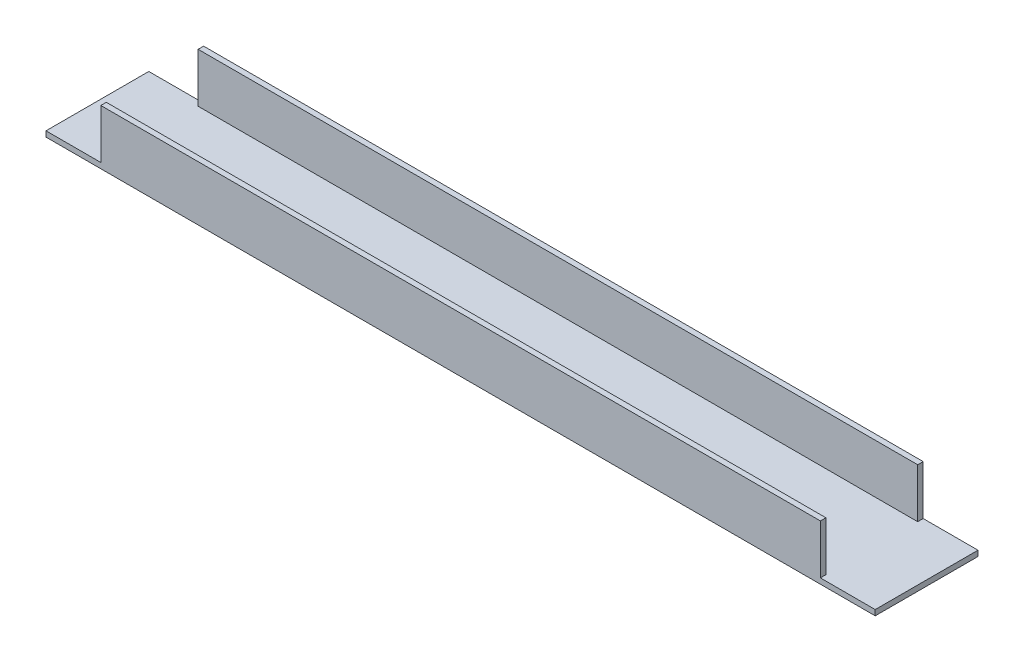
ISO-10303-21;
HEADER;
FILE_DESCRIPTION(('STEP AP214'),'2;1');
FILE_NAME('part.step','',(''),(''),'','','');
FILE_SCHEMA(('AUTOMOTIVE_DESIGN { 1 0 10303 214 1 1 1 1 }'));
ENDSEC;
DATA;
#1=APPLICATION_CONTEXT('core data for automotive mechanical design processes');
#2=APPLICATION_PROTOCOL_DEFINITION('international standard','automotive_design',2000,#1);
#3=PRODUCT_CONTEXT('',#1,'mechanical');
#4=PRODUCT('Part','Part','',(#3));
#5=PRODUCT_RELATED_PRODUCT_CATEGORY('part','',(#4));
#6=PRODUCT_DEFINITION_FORMATION('','',#4);
#7=PRODUCT_DEFINITION_CONTEXT('part definition',#1,'design');
#8=PRODUCT_DEFINITION('design','',#6,#7);
#9=PRODUCT_DEFINITION_SHAPE('','',#8);
#10=(LENGTH_UNIT() NAMED_UNIT(*) SI_UNIT(.MILLI.,.METRE.));
#11=(NAMED_UNIT(*) PLANE_ANGLE_UNIT() SI_UNIT($,.RADIAN.));
#12=(NAMED_UNIT(*) SI_UNIT($,.STERADIAN.) SOLID_ANGLE_UNIT());
#13=UNCERTAINTY_MEASURE_WITH_UNIT(LENGTH_MEASURE(1.E-05),#10,'distance_accuracy_value','');
#14=(GEOMETRIC_REPRESENTATION_CONTEXT(3) GLOBAL_UNCERTAINTY_ASSIGNED_CONTEXT((#13)) GLOBAL_UNIT_ASSIGNED_CONTEXT((#10,
#11,#12)) REPRESENTATION_CONTEXT('',''));
#15=CARTESIAN_POINT('',(0.,0.,0.));
#16=DIRECTION('',(0.,0.,1.));
#17=DIRECTION('',(1.,0.,0.));
#18=AXIS2_PLACEMENT_3D('',#15,#16,#17);
#19=CARTESIAN_POINT('',(0.,4.,0.));
#20=DIRECTION('',(1.,0.,0.));
#21=DIRECTION('',(0.,0.,-1.));
#22=AXIS2_PLACEMENT_3D('',#19,#20,#21);
#23=PLANE('',#22);
#24=DIRECTION('',(0.,0.,1.));
#25=VECTOR('',#24,1.);
#26=CARTESIAN_POINT('',(0.,0.,0.));
#27=LINE('',#26,#25);
#28=CARTESIAN_POINT('',(0.,0.,-75.));
#29=VERTEX_POINT('',#28);
#30=CARTESIAN_POINT('',(0.,0.,0.));
#31=VERTEX_POINT('',#30);
#32=EDGE_CURVE('E222',#29,#31,#27,.T.);
#33=ORIENTED_EDGE('',*,*,#32,.T.);
#34=DIRECTION('',(0.,-1.,0.));
#35=VECTOR('',#34,1.);
#36=CARTESIAN_POINT('',(0.,4.,0.));
#37=LINE('',#36,#35);
#38=CARTESIAN_POINT('',(0.,4.,0.));
#39=VERTEX_POINT('',#38);
#40=EDGE_CURVE('E11',#39,#31,#37,.T.);
#41=ORIENTED_EDGE('',*,*,#40,.F.);
#42=DIRECTION('',(0.,0.,1.));
#43=VECTOR('',#42,1.);
#44=CARTESIAN_POINT('',(0.,4.,0.));
#45=LINE('',#44,#43);
#46=CARTESIAN_POINT('',(0.,4.,-75.));
#47=VERTEX_POINT('',#46);
#48=EDGE_CURVE('E223',#47,#39,#45,.T.);
#49=ORIENTED_EDGE('',*,*,#48,.F.);
#50=DIRECTION('',(0.,-1.,0.));
#51=VECTOR('',#50,1.);
#52=CARTESIAN_POINT('',(0.,4.,-75.));
#53=LINE('',#52,#51);
#54=EDGE_CURVE('E240',#47,#29,#53,.T.);
#55=ORIENTED_EDGE('',*,*,#54,.T.);
#56=EDGE_LOOP('',(#33,#41,#49,#55));
#57=FACE_BOUND('',#56,.T.);
#58=ADVANCED_FACE('F45',(#57),#23,.F.);
#59=CARTESIAN_POINT('',(0.,4.,0.));
#60=DIRECTION('',(0.,0.,-1.));
#61=DIRECTION('',(-1.,0.,0.));
#62=AXIS2_PLACEMENT_3D('',#59,#60,#61);
#63=PLANE('',#62);
#64=DIRECTION('',(1.,0.,0.));
#65=VECTOR('',#64,1.);
#66=CARTESIAN_POINT('',(0.,0.,0.));
#67=LINE('',#66,#65);
#68=CARTESIAN_POINT('',(605.,0.,0.));
#69=VERTEX_POINT('',#68);
#70=EDGE_CURVE('E244',#31,#69,#67,.T.);
#71=ORIENTED_EDGE('',*,*,#70,.T.);
#72=DIRECTION('',(0.,-1.,0.));
#73=VECTOR('',#72,1.);
#74=CARTESIAN_POINT('',(605.,4.,0.));
#75=LINE('',#74,#73);
#76=CARTESIAN_POINT('',(605.,4.,0.));
#77=VERTEX_POINT('',#76);
#78=EDGE_CURVE('E53',#77,#69,#75,.T.);
#79=ORIENTED_EDGE('',*,*,#78,.F.);
#80=DIRECTION('',(1.,0.,0.));
#81=VECTOR('',#80,1.);
#82=CARTESIAN_POINT('',(0.,4.,0.));
#83=LINE('',#82,#81);
#84=CARTESIAN_POINT('',(565.,4.,0.));
#85=VERTEX_POINT('',#84);
#86=EDGE_CURVE('E227',#85,#77,#83,.T.);
#87=ORIENTED_EDGE('',*,*,#86,.F.);
#88=DIRECTION('',(0.,-1.,0.));
#89=VECTOR('',#88,1.);
#90=CARTESIAN_POINT('',(565.,40.,0.));
#91=LINE('',#90,#89);
#92=CARTESIAN_POINT('',(565.,40.,0.));
#93=VERTEX_POINT('',#92);
#94=EDGE_CURVE('E198',#93,#85,#91,.T.);
#95=ORIENTED_EDGE('',*,*,#94,.F.);
#96=DIRECTION('',(-1.,0.,0.));
#97=VECTOR('',#96,1.);
#98=CARTESIAN_POINT('',(0.,40.,0.));
#99=LINE('',#98,#97);
#100=CARTESIAN_POINT('',(40.,40.,0.));
#101=VERTEX_POINT('',#100);
#102=EDGE_CURVE('E182',#93,#101,#99,.T.);
#103=ORIENTED_EDGE('',*,*,#102,.T.);
#104=DIRECTION('',(0.,-1.,0.));
#105=VECTOR('',#104,1.);
#106=CARTESIAN_POINT('',(40.,40.,0.));
#107=LINE('',#106,#105);
#108=CARTESIAN_POINT('',(40.,4.,0.));
#109=VERTEX_POINT('',#108);
#110=EDGE_CURVE('E197',#101,#109,#107,.T.);
#111=ORIENTED_EDGE('',*,*,#110,.T.);
#112=EDGE_CURVE('E229',#39,#109,#83,.T.);
#113=ORIENTED_EDGE('',*,*,#112,.F.);
#114=ORIENTED_EDGE('',*,*,#40,.T.);
#115=EDGE_LOOP('',(#71,#79,#87,#95,#103,#111,#113,#114));
#116=FACE_BOUND('',#115,.T.);
#117=ADVANCED_FACE('F280',(#116),#63,.F.);
#118=CARTESIAN_POINT('',(605.,4.,0.));
#119=DIRECTION('',(-1.,0.,0.));
#120=DIRECTION('',(0.,0.,1.));
#121=AXIS2_PLACEMENT_3D('',#118,#119,#120);
#122=PLANE('',#121);
#123=DIRECTION('',(0.,0.,-1.));
#124=VECTOR('',#123,1.);
#125=CARTESIAN_POINT('',(605.,0.,0.));
#126=LINE('',#125,#124);
#127=CARTESIAN_POINT('',(605.,0.,-75.));
#128=VERTEX_POINT('',#127);
#129=EDGE_CURVE('E247',#69,#128,#126,.T.);
#130=ORIENTED_EDGE('',*,*,#129,.T.);
#131=DIRECTION('',(0.,-1.,0.));
#132=VECTOR('',#131,1.);
#133=CARTESIAN_POINT('',(605.,4.,-75.));
#134=LINE('',#133,#132);
#135=CARTESIAN_POINT('',(605.,4.,-75.));
#136=VERTEX_POINT('',#135);
#137=EDGE_CURVE('E255',#136,#128,#134,.T.);
#138=ORIENTED_EDGE('',*,*,#137,.F.);
#139=DIRECTION('',(0.,0.,-1.));
#140=VECTOR('',#139,1.);
#141=CARTESIAN_POINT('',(605.,4.,0.));
#142=LINE('',#141,#140);
#143=EDGE_CURVE('E233',#77,#136,#142,.T.);
#144=ORIENTED_EDGE('',*,*,#143,.F.);
#145=ORIENTED_EDGE('',*,*,#78,.T.);
#146=EDGE_LOOP('',(#130,#138,#144,#145));
#147=FACE_BOUND('',#146,.T.);
#148=ADVANCED_FACE('F264',(#147),#122,.F.);
#149=CARTESIAN_POINT('',(0.,4.,-75.));
#150=DIRECTION('',(0.,0.,1.));
#151=DIRECTION('',(1.,0.,0.));
#152=AXIS2_PLACEMENT_3D('',#149,#150,#151);
#153=PLANE('',#152);
#154=DIRECTION('',(-1.,0.,0.));
#155=VECTOR('',#154,1.);
#156=CARTESIAN_POINT('',(0.,0.,-75.));
#157=LINE('',#156,#155);
#158=EDGE_CURVE('E228',#128,#29,#157,.T.);
#159=ORIENTED_EDGE('',*,*,#158,.T.);
#160=ORIENTED_EDGE('',*,*,#54,.F.);
#161=DIRECTION('',(-1.,0.,0.));
#162=VECTOR('',#161,1.);
#163=CARTESIAN_POINT('',(0.,4.,-75.));
#164=LINE('',#163,#162);
#165=CARTESIAN_POINT('',(40.,4.,-74.9999999999999));
#166=VERTEX_POINT('',#165);
#167=EDGE_CURVE('E140',#166,#47,#164,.T.);
#168=ORIENTED_EDGE('',*,*,#167,.F.);
#169=DIRECTION('',(0.,-1.,0.));
#170=VECTOR('',#169,1.);
#171=CARTESIAN_POINT('',(40.,40.,-74.9999999999999));
#172=LINE('',#171,#170);
#173=CARTESIAN_POINT('',(40.,40.,-74.9999999999999));
#174=VERTEX_POINT('',#173);
#175=EDGE_CURVE('E134',#174,#166,#172,.T.);
#176=ORIENTED_EDGE('',*,*,#175,.F.);
#177=DIRECTION('',(1.,0.,0.));
#178=VECTOR('',#177,1.);
#179=CARTESIAN_POINT('',(0.,40.,-74.9999999999999));
#180=LINE('',#179,#178);
#181=CARTESIAN_POINT('',(565.,40.,-75.));
#182=VERTEX_POINT('',#181);
#183=EDGE_CURVE('E138',#174,#182,#180,.T.);
#184=ORIENTED_EDGE('',*,*,#183,.T.);
#185=DIRECTION('',(0.,-1.,0.));
#186=VECTOR('',#185,1.);
#187=CARTESIAN_POINT('',(565.,40.,-75.));
#188=LINE('',#187,#186);
#189=CARTESIAN_POINT('',(565.,4.,-75.));
#190=VERTEX_POINT('',#189);
#191=EDGE_CURVE('E162',#182,#190,#188,.T.);
#192=ORIENTED_EDGE('',*,*,#191,.T.);
#193=EDGE_CURVE('E236',#136,#190,#164,.T.);
#194=ORIENTED_EDGE('',*,*,#193,.F.);
#195=ORIENTED_EDGE('',*,*,#137,.T.);
#196=EDGE_LOOP('',(#159,#160,#168,#176,#184,#192,#194,#195));
#197=FACE_BOUND('',#196,.T.);
#198=ADVANCED_FACE('F136',(#197),#153,.F.);
#199=CARTESIAN_POINT('',(0.,4.,0.));
#200=DIRECTION('',(0.,-1.,0.));
#201=DIRECTION('',(0.,0.,-1.));
#202=AXIS2_PLACEMENT_3D('',#199,#200,#201);
#203=PLANE('',#202);
#204=DIRECTION('',(-1.,0.,0.));
#205=VECTOR('',#204,1.);
#206=CARTESIAN_POINT('',(0.,4.,-70.9999999999999));
#207=LINE('',#206,#205);
#208=CARTESIAN_POINT('',(565.,4.,-71.));
#209=VERTEX_POINT('',#208);
#210=CARTESIAN_POINT('',(40.,4.,-70.9999999999999));
#211=VERTEX_POINT('',#210);
#212=EDGE_CURVE('E175',#209,#211,#207,.T.);
#213=ORIENTED_EDGE('',*,*,#212,.T.);
#214=DIRECTION('',(0.,0.,-1.));
#215=VECTOR('',#214,1.);
#216=CARTESIAN_POINT('',(40.0000000000002,4.,0.));
#217=LINE('',#216,#215);
#218=EDGE_CURVE('E179',#211,#166,#217,.T.);
#219=ORIENTED_EDGE('',*,*,#218,.T.);
#220=ORIENTED_EDGE('',*,*,#167,.T.);
#221=ORIENTED_EDGE('',*,*,#48,.T.);
#222=ORIENTED_EDGE('',*,*,#112,.T.);
#223=DIRECTION('',(0.,0.,-1.));
#224=VECTOR('',#223,1.);
#225=CARTESIAN_POINT('',(40.,4.,0.));
#226=LINE('',#225,#224);
#227=CARTESIAN_POINT('',(40.,4.,-4.));
#228=VERTEX_POINT('',#227);
#229=EDGE_CURVE('E201',#109,#228,#226,.T.);
#230=ORIENTED_EDGE('',*,*,#229,.T.);
#231=DIRECTION('',(1.,0.,0.));
#232=VECTOR('',#231,1.);
#233=CARTESIAN_POINT('',(0.,4.,-4.));
#234=LINE('',#233,#232);
#235=CARTESIAN_POINT('',(565.,4.,-4.));
#236=VERTEX_POINT('',#235);
#237=EDGE_CURVE('E214',#228,#236,#234,.T.);
#238=ORIENTED_EDGE('',*,*,#237,.T.);
#239=DIRECTION('',(0.,0.,1.));
#240=VECTOR('',#239,1.);
#241=CARTESIAN_POINT('',(565.,4.,0.));
#242=LINE('',#241,#240);
#243=EDGE_CURVE('E218',#236,#85,#242,.T.);
#244=ORIENTED_EDGE('',*,*,#243,.T.);
#245=ORIENTED_EDGE('',*,*,#86,.T.);
#246=ORIENTED_EDGE('',*,*,#143,.T.);
#247=ORIENTED_EDGE('',*,*,#193,.T.);
#248=DIRECTION('',(0.,0.,1.));
#249=VECTOR('',#248,1.);
#250=CARTESIAN_POINT('',(565.,4.,0.));
#251=LINE('',#250,#249);
#252=EDGE_CURVE('E155',#190,#209,#251,.T.);
#253=ORIENTED_EDGE('',*,*,#252,.T.);
#254=EDGE_LOOP('',(#213,#219,#220,#221,#222,#230,#238,#244,#245,#246,#247,#253));
#255=FACE_BOUND('',#254,.T.);
#256=ADVANCED_FACE('F277',(#255),#203,.F.);
#257=CARTESIAN_POINT('',(0.,0.,0.));
#258=DIRECTION('',(0.,-1.,0.));
#259=DIRECTION('',(0.,0.,-1.));
#260=AXIS2_PLACEMENT_3D('',#257,#258,#259);
#261=PLANE('',#260);
#262=ORIENTED_EDGE('',*,*,#32,.F.);
#263=ORIENTED_EDGE('',*,*,#158,.F.);
#264=ORIENTED_EDGE('',*,*,#129,.F.);
#265=ORIENTED_EDGE('',*,*,#70,.F.);
#266=EDGE_LOOP('',(#262,#263,#264,#265));
#267=FACE_BOUND('',#266,.T.);
#268=ADVANCED_FACE('F271',(#267),#261,.T.);
#269=CARTESIAN_POINT('',(565.,40.,0.));
#270=DIRECTION('',(1.,0.,0.));
#271=DIRECTION('',(0.,0.,-1.));
#272=AXIS2_PLACEMENT_3D('',#269,#270,#271);
#273=PLANE('',#272);
#274=ORIENTED_EDGE('',*,*,#243,.F.);
#275=DIRECTION('',(0.,-1.,0.));
#276=VECTOR('',#275,1.);
#277=CARTESIAN_POINT('',(565.,40.,-4.));
#278=LINE('',#277,#276);
#279=CARTESIAN_POINT('',(565.,40.,-4.));
#280=VERTEX_POINT('',#279);
#281=EDGE_CURVE('E202',#280,#236,#278,.T.);
#282=ORIENTED_EDGE('',*,*,#281,.F.);
#283=DIRECTION('',(0.,0.,1.));
#284=VECTOR('',#283,1.);
#285=CARTESIAN_POINT('',(565.,40.,0.));
#286=LINE('',#285,#284);
#287=EDGE_CURVE('E193',#280,#93,#286,.T.);
#288=ORIENTED_EDGE('',*,*,#287,.T.);
#289=ORIENTED_EDGE('',*,*,#94,.T.);
#290=EDGE_LOOP('',(#274,#282,#288,#289));
#291=FACE_BOUND('',#290,.T.);
#292=ADVANCED_FACE('F288',(#291),#273,.T.);
#293=CARTESIAN_POINT('',(0.,40.,-4.));
#294=DIRECTION('',(0.,0.,-1.));
#295=DIRECTION('',(-1.,0.,0.));
#296=AXIS2_PLACEMENT_3D('',#293,#294,#295);
#297=PLANE('',#296);
#298=ORIENTED_EDGE('',*,*,#237,.F.);
#299=DIRECTION('',(0.,-1.,0.));
#300=VECTOR('',#299,1.);
#301=CARTESIAN_POINT('',(40.,40.,-4.));
#302=LINE('',#301,#300);
#303=CARTESIAN_POINT('',(40.,40.,-4.));
#304=VERTEX_POINT('',#303);
#305=EDGE_CURVE('E68',#304,#228,#302,.T.);
#306=ORIENTED_EDGE('',*,*,#305,.F.);
#307=DIRECTION('',(1.,0.,0.));
#308=VECTOR('',#307,1.);
#309=CARTESIAN_POINT('',(0.,40.,-4.));
#310=LINE('',#309,#308);
#311=EDGE_CURVE('E189',#304,#280,#310,.T.);
#312=ORIENTED_EDGE('',*,*,#311,.T.);
#313=ORIENTED_EDGE('',*,*,#281,.T.);
#314=EDGE_LOOP('',(#298,#306,#312,#313));
#315=FACE_BOUND('',#314,.T.);
#316=ADVANCED_FACE('F290',(#315),#297,.T.);
#317=CARTESIAN_POINT('',(40.,40.,0.));
#318=DIRECTION('',(-1.,0.,0.));
#319=DIRECTION('',(0.,0.,1.));
#320=AXIS2_PLACEMENT_3D('',#317,#318,#319);
#321=PLANE('',#320);
#322=ORIENTED_EDGE('',*,*,#229,.F.);
#323=ORIENTED_EDGE('',*,*,#110,.F.);
#324=DIRECTION('',(0.,0.,-1.));
#325=VECTOR('',#324,1.);
#326=CARTESIAN_POINT('',(40.,40.,0.));
#327=LINE('',#326,#325);
#328=EDGE_CURVE('E186',#101,#304,#327,.T.);
#329=ORIENTED_EDGE('',*,*,#328,.T.);
#330=ORIENTED_EDGE('',*,*,#305,.T.);
#331=EDGE_LOOP('',(#322,#323,#329,#330));
#332=FACE_BOUND('',#331,.T.);
#333=ADVANCED_FACE('F291',(#332),#321,.T.);
#334=CARTESIAN_POINT('',(0.,40.,0.));
#335=DIRECTION('',(0.,-1.,0.));
#336=DIRECTION('',(0.,0.,-1.));
#337=AXIS2_PLACEMENT_3D('',#334,#335,#336);
#338=PLANE('',#337);
#339=ORIENTED_EDGE('',*,*,#102,.F.);
#340=ORIENTED_EDGE('',*,*,#287,.F.);
#341=ORIENTED_EDGE('',*,*,#311,.F.);
#342=ORIENTED_EDGE('',*,*,#328,.F.);
#343=EDGE_LOOP('',(#339,#340,#341,#342));
#344=FACE_BOUND('',#343,.T.);
#345=ADVANCED_FACE('F286',(#344),#338,.F.);
#346=CARTESIAN_POINT('',(40.0000000000002,40.,0.));
#347=DIRECTION('',(-1.,0.,0.));
#348=DIRECTION('',(0.,0.,1.));
#349=AXIS2_PLACEMENT_3D('',#346,#347,#348);
#350=PLANE('',#349);
#351=ORIENTED_EDGE('',*,*,#218,.F.);
#352=DIRECTION('',(0.,-1.,0.));
#353=VECTOR('',#352,1.);
#354=CARTESIAN_POINT('',(40.,40.,-70.9999999999999));
#355=LINE('',#354,#353);
#356=CARTESIAN_POINT('',(40.,40.,-70.9999999999999));
#357=VERTEX_POINT('',#356);
#358=EDGE_CURVE('E145',#357,#211,#355,.T.);
#359=ORIENTED_EDGE('',*,*,#358,.F.);
#360=DIRECTION('',(0.,0.,-1.));
#361=VECTOR('',#360,1.);
#362=CARTESIAN_POINT('',(40.0000000000002,40.,0.));
#363=LINE('',#362,#361);
#364=EDGE_CURVE('E152',#357,#174,#363,.T.);
#365=ORIENTED_EDGE('',*,*,#364,.T.);
#366=ORIENTED_EDGE('',*,*,#175,.T.);
#367=EDGE_LOOP('',(#351,#359,#365,#366));
#368=FACE_BOUND('',#367,.T.);
#369=ADVANCED_FACE('F157',(#368),#350,.T.);
#370=CARTESIAN_POINT('',(0.,40.,-70.9999999999999));
#371=DIRECTION('',(0.,0.,1.));
#372=DIRECTION('',(1.,0.,0.));
#373=AXIS2_PLACEMENT_3D('',#370,#371,#372);
#374=PLANE('',#373);
#375=ORIENTED_EDGE('',*,*,#212,.F.);
#376=DIRECTION('',(0.,-1.,0.));
#377=VECTOR('',#376,1.);
#378=CARTESIAN_POINT('',(565.,40.,-71.));
#379=LINE('',#378,#377);
#380=CARTESIAN_POINT('',(565.,40.,-71.));
#381=VERTEX_POINT('',#380);
#382=EDGE_CURVE('E60',#381,#209,#379,.T.);
#383=ORIENTED_EDGE('',*,*,#382,.F.);
#384=DIRECTION('',(-1.,0.,0.));
#385=VECTOR('',#384,1.);
#386=CARTESIAN_POINT('',(0.,40.,-70.9999999999999));
#387=LINE('',#386,#385);
#388=EDGE_CURVE('E161',#381,#357,#387,.T.);
#389=ORIENTED_EDGE('',*,*,#388,.T.);
#390=ORIENTED_EDGE('',*,*,#358,.T.);
#391=EDGE_LOOP('',(#375,#383,#389,#390));
#392=FACE_BOUND('',#391,.T.);
#393=ADVANCED_FACE('F356',(#392),#374,.T.);
#394=CARTESIAN_POINT('',(565.,40.,0.));
#395=DIRECTION('',(1.,0.,0.));
#396=DIRECTION('',(0.,0.,-1.));
#397=AXIS2_PLACEMENT_3D('',#394,#395,#396);
#398=PLANE('',#397);
#399=ORIENTED_EDGE('',*,*,#252,.F.);
#400=ORIENTED_EDGE('',*,*,#191,.F.);
#401=DIRECTION('',(0.,0.,1.));
#402=VECTOR('',#401,1.);
#403=CARTESIAN_POINT('',(565.,40.,0.));
#404=LINE('',#403,#402);
#405=EDGE_CURVE('E153',#182,#381,#404,.T.);
#406=ORIENTED_EDGE('',*,*,#405,.T.);
#407=ORIENTED_EDGE('',*,*,#382,.T.);
#408=EDGE_LOOP('',(#399,#400,#406,#407));
#409=FACE_BOUND('',#408,.T.);
#410=ADVANCED_FACE('F365',(#409),#398,.T.);
#411=CARTESIAN_POINT('',(0.,40.,0.));
#412=DIRECTION('',(0.,-1.,0.));
#413=DIRECTION('',(0.,0.,-1.));
#414=AXIS2_PLACEMENT_3D('',#411,#412,#413);
#415=PLANE('',#414);
#416=ORIENTED_EDGE('',*,*,#183,.F.);
#417=ORIENTED_EDGE('',*,*,#364,.F.);
#418=ORIENTED_EDGE('',*,*,#388,.F.);
#419=ORIENTED_EDGE('',*,*,#405,.F.);
#420=EDGE_LOOP('',(#416,#417,#418,#419));
#421=FACE_BOUND('',#420,.T.);
#422=ADVANCED_FACE('F150',(#421),#415,.F.);
#423=CLOSED_SHELL('',(#58,#117,#148,#198,#256,#268,#292,#316,#333,#345,#369,#393,#410,#422));
#424=MANIFOLD_SOLID_BREP('B2',#423);
#425=ADVANCED_BREP_SHAPE_REPRESENTATION('',(#18,#424),#14);
#426=SHAPE_DEFINITION_REPRESENTATION(#9,#425);
ENDSEC;
END-ISO-10303-21;
